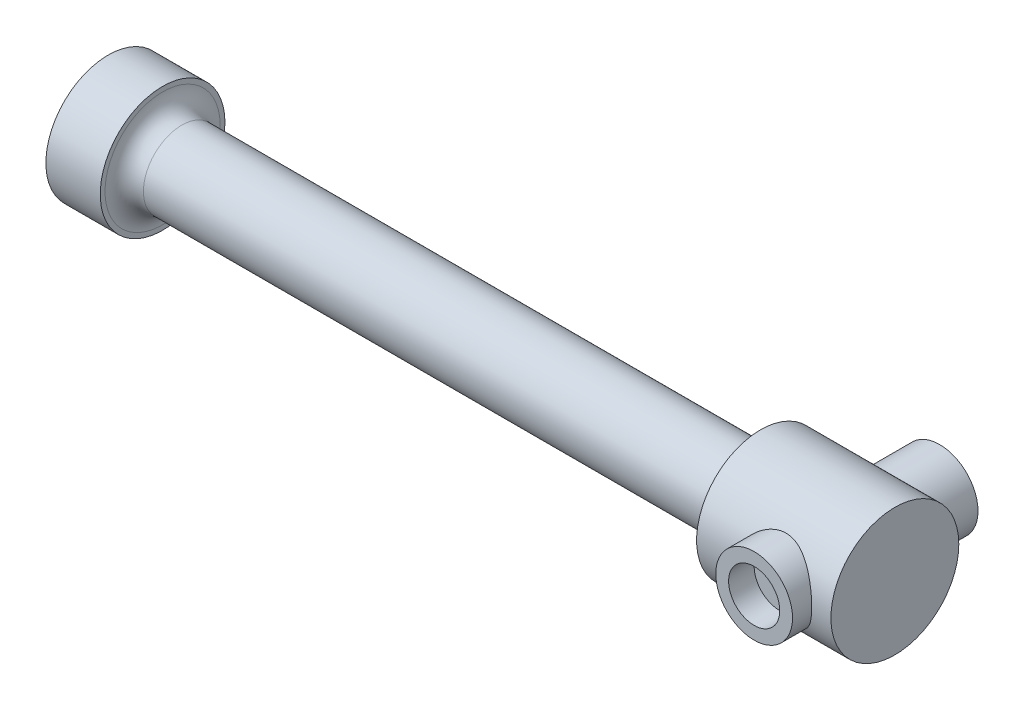
ISO-10303-21;
HEADER;
FILE_DESCRIPTION(('STEP AP214'),'2;1');
FILE_NAME('part.step','',(''),(''),'','','');
FILE_SCHEMA(('AUTOMOTIVE_DESIGN { 1 0 10303 214 1 1 1 1 }'));
ENDSEC;
DATA;
#1=APPLICATION_CONTEXT('core data for automotive mechanical design processes');
#2=APPLICATION_PROTOCOL_DEFINITION('international standard','automotive_design',2000,#1);
#3=PRODUCT_CONTEXT('',#1,'mechanical');
#4=PRODUCT('Part','Part','',(#3));
#5=PRODUCT_RELATED_PRODUCT_CATEGORY('part','',(#4));
#6=PRODUCT_DEFINITION_FORMATION('','',#4);
#7=PRODUCT_DEFINITION_CONTEXT('part definition',#1,'design');
#8=PRODUCT_DEFINITION('design','',#6,#7);
#9=PRODUCT_DEFINITION_SHAPE('','',#8);
#10=(LENGTH_UNIT() NAMED_UNIT(*) SI_UNIT(.MILLI.,.METRE.));
#11=(NAMED_UNIT(*) PLANE_ANGLE_UNIT() SI_UNIT($,.RADIAN.));
#12=(NAMED_UNIT(*) SI_UNIT($,.STERADIAN.) SOLID_ANGLE_UNIT());
#13=UNCERTAINTY_MEASURE_WITH_UNIT(LENGTH_MEASURE(1.E-05),#10,'distance_accuracy_value','');
#14=(GEOMETRIC_REPRESENTATION_CONTEXT(3) GLOBAL_UNCERTAINTY_ASSIGNED_CONTEXT((#13)) GLOBAL_UNIT_ASSIGNED_CONTEXT((#10,
#11,#12)) REPRESENTATION_CONTEXT('',''));
#15=CARTESIAN_POINT('',(0.,0.,0.));
#16=DIRECTION('',(0.,0.,1.));
#17=DIRECTION('',(1.,0.,0.));
#18=AXIS2_PLACEMENT_3D('',#15,#16,#17);
#19=CARTESIAN_POINT('',(114.,0.,-16.001));
#20=DIRECTION('',(0.,0.,1.));
#21=DIRECTION('',(1.,0.,0.));
#22=AXIS2_PLACEMENT_3D('',#19,#20,#21);
#23=CYLINDRICAL_SURFACE('',#22,1.5);
#24=CARTESIAN_POINT('',(114.,0.,9.));
#25=DIRECTION('',(0.,0.,1.));
#26=DIRECTION('',(1.,0.,0.));
#27=AXIS2_PLACEMENT_3D('',#24,#25,#26);
#28=CIRCLE('',#27,1.5);
#29=CARTESIAN_POINT('',(115.5,0.,9.));
#30=VERTEX_POINT('',#29);
#31=EDGE_CURVE('E286',#30,#30,#28,.T.);
#32=ORIENTED_EDGE('',*,*,#31,.T.);
#33=EDGE_LOOP('',(#32));
#34=FACE_BOUND('',#33,.T.);
#35=CARTESIAN_POINT('',(114.,0.,-12.));
#36=DIRECTION('',(0.,0.,-1.));
#37=DIRECTION('',(-1.,0.,0.));
#38=AXIS2_PLACEMENT_3D('',#35,#36,#37);
#39=CIRCLE('',#38,1.5);
#40=CARTESIAN_POINT('',(112.5,0.,-12.));
#41=VERTEX_POINT('',#40);
#42=EDGE_CURVE('E37',#41,#41,#39,.F.);
#43=ORIENTED_EDGE('',*,*,#42,.F.);
#44=EDGE_LOOP('',(#43));
#45=FACE_BOUND('',#44,.T.);
#46=ADVANCED_FACE('F33',(#34,#45),#23,.F.);
#47=CARTESIAN_POINT('',(8.5,0.,0.));
#48=DIRECTION('',(1.,0.,0.));
#49=DIRECTION('',(0.,0.,-1.));
#50=AXIS2_PLACEMENT_3D('',#47,#48,#49);
#51=PLANE('',#50);
#52=CARTESIAN_POINT('',(8.5,0.,0.));
#53=DIRECTION('',(1.,0.,0.));
#54=DIRECTION('',(0.,0.,-1.));
#55=AXIS2_PLACEMENT_3D('',#52,#53,#54);
#56=CIRCLE('',#55,9.);
#57=CARTESIAN_POINT('',(8.5,0.,-9.));
#58=VERTEX_POINT('',#57);
#59=EDGE_CURVE('E46',#58,#58,#56,.F.);
#60=ORIENTED_EDGE('',*,*,#59,.T.);
#61=EDGE_LOOP('',(#60));
#62=FACE_BOUND('',#61,.T.);
#63=CARTESIAN_POINT('',(8.5,0.,0.));
#64=DIRECTION('',(1.,0.,0.));
#65=DIRECTION('',(0.,0.,-1.));
#66=AXIS2_PLACEMENT_3D('',#63,#64,#65);
#67=CIRCLE('',#66,9.75);
#68=CARTESIAN_POINT('',(8.5,0.,-9.75));
#69=VERTEX_POINT('',#68);
#70=EDGE_CURVE('E142',#69,#69,#67,.T.);
#71=ORIENTED_EDGE('',*,*,#70,.T.);
#72=EDGE_LOOP('',(#71));
#73=FACE_BOUND('',#72,.T.);
#74=ADVANCED_FACE('F93',(#62,#73),#51,.T.);
#75=CARTESIAN_POINT('',(8.5,0.,0.));
#76=DIRECTION('',(-1.,0.,0.));
#77=DIRECTION('',(0.,0.,1.));
#78=AXIS2_PLACEMENT_3D('',#75,#76,#77);
#79=CYLINDRICAL_SURFACE('',#78,9.75);
#80=ORIENTED_EDGE('',*,*,#70,.F.);
#81=EDGE_LOOP('',(#80));
#82=FACE_BOUND('',#81,.T.);
#83=CARTESIAN_POINT('',(0.,0.,0.));
#84=DIRECTION('',(1.,0.,0.));
#85=DIRECTION('',(0.,0.,-1.));
#86=AXIS2_PLACEMENT_3D('',#83,#84,#85);
#87=CIRCLE('',#86,9.75);
#88=CARTESIAN_POINT('',(0.,0.,-9.75));
#89=VERTEX_POINT('',#88);
#90=EDGE_CURVE('E138',#89,#89,#87,.T.);
#91=ORIENTED_EDGE('',*,*,#90,.T.);
#92=EDGE_LOOP('',(#91));
#93=FACE_BOUND('',#92,.T.);
#94=ADVANCED_FACE('F99',(#82,#93),#79,.T.);
#95=CARTESIAN_POINT('',(0.,0.,0.));
#96=DIRECTION('',(1.,0.,0.));
#97=DIRECTION('',(0.,0.,-1.));
#98=AXIS2_PLACEMENT_3D('',#95,#96,#97);
#99=PLANE('',#98);
#100=ORIENTED_EDGE('',*,*,#90,.F.);
#101=EDGE_LOOP('',(#100));
#102=FACE_BOUND('',#101,.T.);
#103=ADVANCED_FACE('F156',(#102),#99,.F.);
#104=CARTESIAN_POINT('',(102.,0.,0.));
#105=DIRECTION('',(-1.,0.,0.));
#106=DIRECTION('',(0.,0.,1.));
#107=AXIS2_PLACEMENT_3D('',#104,#105,#106);
#108=CYLINDRICAL_SURFACE('',#107,6.);
#109=CARTESIAN_POINT('',(100.,0.,0.));
#110=DIRECTION('',(1.,0.,0.));
#111=DIRECTION('',(0.,0.,-1.));
#112=AXIS2_PLACEMENT_3D('',#109,#110,#111);
#113=CIRCLE('',#112,6.);
#114=CARTESIAN_POINT('',(100.,0.,-6.));
#115=VERTEX_POINT('',#114);
#116=EDGE_CURVE('E10',#115,#115,#113,.F.);
#117=ORIENTED_EDGE('',*,*,#116,.T.);
#118=EDGE_LOOP('',(#117));
#119=FACE_BOUND('',#118,.T.);
#120=CARTESIAN_POINT('',(11.5,0.,0.));
#121=DIRECTION('',(1.,0.,0.));
#122=DIRECTION('',(0.,0.,-1.));
#123=AXIS2_PLACEMENT_3D('',#120,#121,#122);
#124=CIRCLE('',#123,6.);
#125=CARTESIAN_POINT('',(11.5,0.,-6.));
#126=VERTEX_POINT('',#125);
#127=EDGE_CURVE('E145',#126,#126,#124,.T.);
#128=ORIENTED_EDGE('',*,*,#127,.T.);
#129=EDGE_LOOP('',(#128));
#130=FACE_BOUND('',#129,.T.);
#131=ADVANCED_FACE('F89',(#119,#130),#108,.T.);
#132=CARTESIAN_POINT('',(11.5,0.,0.));
#133=DIRECTION('',(1.,0.,0.));
#134=DIRECTION('',(0.,0.,-1.));
#135=AXIS2_PLACEMENT_3D('',#132,#133,#134);
#136=TOROIDAL_SURFACE('',#135,9.,3.);
#137=ORIENTED_EDGE('',*,*,#59,.F.);
#138=EDGE_LOOP('',(#137));
#139=FACE_BOUND('',#138,.T.);
#140=ORIENTED_EDGE('',*,*,#127,.F.);
#141=EDGE_LOOP('',(#140));
#142=FACE_BOUND('',#141,.T.);
#143=ADVANCED_FACE('F82',(#139,#142),#136,.F.);
#144=CARTESIAN_POINT('',(102.,0.,0.));
#145=DIRECTION('',(1.,0.,0.));
#146=DIRECTION('',(0.,0.,-1.));
#147=AXIS2_PLACEMENT_3D('',#144,#145,#146);
#148=PLANE('',#147);
#149=CARTESIAN_POINT('',(102.,0.,0.));
#150=DIRECTION('',(1.,0.,0.));
#151=DIRECTION('',(0.,0.,-1.));
#152=AXIS2_PLACEMENT_3D('',#149,#150,#151);
#153=CIRCLE('',#152,8.);
#154=CARTESIAN_POINT('',(102.,0.,-8.));
#155=VERTEX_POINT('',#154);
#156=EDGE_CURVE('E41',#155,#155,#153,.T.);
#157=ORIENTED_EDGE('',*,*,#156,.T.);
#158=EDGE_LOOP('',(#157));
#159=FACE_BOUND('',#158,.T.);
#160=CARTESIAN_POINT('',(102.,0.,0.));
#161=DIRECTION('',(1.,0.,0.));
#162=DIRECTION('',(0.,0.,-1.));
#163=AXIS2_PLACEMENT_3D('',#160,#161,#162);
#164=CIRCLE('',#163,10.);
#165=CARTESIAN_POINT('',(102.,0.,-10.));
#166=VERTEX_POINT('',#165);
#167=EDGE_CURVE('E139',#166,#166,#164,.T.);
#168=ORIENTED_EDGE('',*,*,#167,.F.);
#169=EDGE_LOOP('',(#168));
#170=FACE_BOUND('',#169,.T.);
#171=ADVANCED_FACE('F80',(#159,#170),#148,.F.);
#172=CARTESIAN_POINT('',(123.,0.,0.));
#173=DIRECTION('',(-1.,0.,0.));
#174=DIRECTION('',(0.,0.,1.));
#175=AXIS2_PLACEMENT_3D('',#172,#173,#174);
#176=CYLINDRICAL_SURFACE('',#175,10.);
#177=CARTESIAN_POINT('',(120.,0.,10.));
#178=CARTESIAN_POINT('',(119.999998745191,-0.153537444551437,9.99999883168644));
#179=CARTESIAN_POINT('',(119.9940973574,-0.307113729394928,9.99645496091162));
#180=CARTESIAN_POINT('',(119.970566986841,-0.613107521326879,9.98236364463673));
#181=CARTESIAN_POINT('',(119.952931142188,-0.76552429760002,9.97181210130936));
#182=CARTESIAN_POINT('',(119.906127895651,-1.06824745150987,9.94394249918953));
#183=CARTESIAN_POINT('',(119.876938661774,-1.21854927251923,9.926611630499));
#184=CARTESIAN_POINT('',(119.807400061742,-1.51572002727398,9.88560105277181));
#185=CARTESIAN_POINT('',(119.767045930178,-1.66258746605991,9.86191863289495));
#186=CARTESIAN_POINT('',(119.675912399103,-1.95109561530948,9.80890481966906));
#187=CARTESIAN_POINT('',(119.62519085957,-2.09276039690219,9.77960483164848));
#188=CARTESIAN_POINT('',(119.513725630889,-2.37093083799643,9.7159192851634));
#189=CARTESIAN_POINT('',(119.452978069542,-2.50743447905545,9.68153176235135));
#190=CARTESIAN_POINT('',(119.256615921481,-2.90796291658618,9.57184162303338));
#191=CARTESIAN_POINT('',(119.106765140666,-3.1633697760085,9.4899416782257));
#192=CARTESIAN_POINT('',(118.760891856919,-3.66523770071095,9.30821070093225));
#193=CARTESIAN_POINT('',(118.562214867513,-3.90952112480153,9.20748739861886));
#194=CARTESIAN_POINT('',(118.130101497822,-4.36354579042122,9.00120183744764));
#195=CARTESIAN_POINT('',(117.896620567373,-4.57324202374219,8.89563349844521));
#196=CARTESIAN_POINT('',(117.508001002179,-4.87082578782842,8.73441166956493));
#197=CARTESIAN_POINT('',(117.363367381755,-4.97182330842635,8.67715724472595));
#198=CARTESIAN_POINT('',(117.064805642624,-5.16122122731058,8.56585317782531));
#199=CARTESIAN_POINT('',(116.910875994797,-5.24961954505302,8.511804065925));
#200=CARTESIAN_POINT('',(116.594622317587,-5.41290775237596,8.40890843735161));
#201=CARTESIAN_POINT('',(116.432309612332,-5.48781528185459,8.36005516160798));
#202=CARTESIAN_POINT('',(116.099941829181,-5.62338163354011,8.26947589323735));
#203=CARTESIAN_POINT('',(115.929889668991,-5.68404577312335,8.22774724242061));
#204=CARTESIAN_POINT('',(115.625079920862,-5.77737221892758,8.16237611554734));
#205=CARTESIAN_POINT('',(115.491716651134,-5.8132588951073,8.13679954295732));
#206=CARTESIAN_POINT('',(115.221870482181,-5.87590039350671,8.09168021123358));
#207=CARTESIAN_POINT('',(115.085388281244,-5.90265723881365,8.07213611544971));
#208=CARTESIAN_POINT('',(114.810251714021,-5.94666970539668,8.03976789878061));
#209=CARTESIAN_POINT('',(114.671599731358,-5.9639350903157,8.02693687297642));
#210=CARTESIAN_POINT('',(114.392944984699,-5.9887526638035,8.00843825390027));
#211=CARTESIAN_POINT('',(114.252942197494,-5.99630468517717,8.00277078393386));
#212=CARTESIAN_POINT('',(113.972369514264,-6.00157990771218,7.99881555301096));
#213=CARTESIAN_POINT('',(113.831799044393,-5.99928372966397,8.00054234240933));
#214=CARTESIAN_POINT('',(113.551452631554,-5.98485668610316,8.01134007353734));
#215=CARTESIAN_POINT('',(113.41167669245,-5.97272577280601,8.02041105095058));
#216=CARTESIAN_POINT('',(113.133876805591,-5.93880584038254,8.04555965197211));
#217=CARTESIAN_POINT('',(112.995853676696,-5.91701246647433,8.06164043478003));
#218=CARTESIAN_POINT('',(112.722505408924,-5.86407894147697,8.10022471868288));
#219=CARTESIAN_POINT('',(112.587181396816,-5.83293497053064,8.12273084444056));
#220=CARTESIAN_POINT('',(112.190039218444,-5.7269806380151,8.19812127089691));
#221=CARTESIAN_POINT('',(111.933129362913,-5.63915194131273,8.25926888138427));
#222=CARTESIAN_POINT('',(111.437182443319,-5.43180047493028,8.39708163578851));
#223=CARTESIAN_POINT('',(111.19815197252,-5.31226608650176,8.47375246584326));
#224=CARTESIAN_POINT('',(110.700051973396,-5.02070076963739,8.65022234735539));
#225=CARTESIAN_POINT('',(110.444785119534,-4.84314550121072,8.75172142070218));
#226=CARTESIAN_POINT('',(110.085230823983,-4.54957124280612,8.90582410728344));
#227=CARTESIAN_POINT('',(109.969189776868,-4.44708318574261,8.95754136048025));
#228=CARTESIAN_POINT('',(109.745217586189,-4.23329437801549,9.06053415675082));
#229=CARTESIAN_POINT('',(109.637287889964,-4.12199206183187,9.11180961955592));
#230=CARTESIAN_POINT('',(109.415562196611,-3.87481857478412,9.21989326570381));
#231=CARTESIAN_POINT('',(109.303055390159,-3.73768795265441,9.27647282365172));
#232=CARTESIAN_POINT('',(109.090073335409,-3.45314122942453,9.38610941141658));
#233=CARTESIAN_POINT('',(108.989593417424,-3.30572915572596,9.43916780480959));
#234=CARTESIAN_POINT('',(108.801519489967,-3.00130059968161,9.54033102133581));
#235=CARTESIAN_POINT('',(108.713923953926,-2.84428525827774,9.58843643110623));
#236=CARTESIAN_POINT('',(108.552589758162,-2.52155783578282,9.67831544597726));
#237=CARTESIAN_POINT('',(108.47884937857,-2.35584683737316,9.72008983683586));
#238=CARTESIAN_POINT('',(108.350395779526,-2.02757278212966,9.79364255267099));
#239=CARTESIAN_POINT('',(108.294776852394,-1.86546851518059,9.82588466787389));
#240=CARTESIAN_POINT('',(108.197354045748,-1.53584722067878,9.88276955471718));
#241=CARTESIAN_POINT('',(108.15554976973,-1.36833034862805,9.90741254446339));
#242=CARTESIAN_POINT('',(108.086455507211,-1.02949369065076,9.94832818480364));
#243=CARTESIAN_POINT('',(108.059151054434,-0.858177873374311,9.96460917751309));
#244=CARTESIAN_POINT('',(108.01947106463,-0.513226306032294,9.9883166876579));
#245=CARTESIAN_POINT('',(108.007093427881,-0.339590885735249,9.99574445045558));
#246=CARTESIAN_POINT('',(107.998136179932,-0.015428594246427,10.0011181661532));
#247=CARTESIAN_POINT('',(107.999637405943,0.135030316693078,10.0002160020556));
#248=CARTESIAN_POINT('',(108.013919562041,0.435218261170644,9.99165275901541));
#249=CARTESIAN_POINT('',(108.026700120559,0.584947318588576,9.98399190272153));
#250=CARTESIAN_POINT('',(108.063367363032,0.882536056591296,9.96209775285793));
#251=CARTESIAN_POINT('',(108.087253288556,1.03039586412686,9.94786490811761));
#252=CARTESIAN_POINT('',(108.145821548111,1.32321247217726,9.913165472997));
#253=CARTESIAN_POINT('',(108.180504150208,1.46816920051815,9.89269872783916));
#254=CARTESIAN_POINT('',(108.259272160967,1.75071908629022,9.84657104453397));
#255=CARTESIAN_POINT('',(108.303105141372,1.88840566825772,9.82105034214295));
#256=CARTESIAN_POINT('',(108.400198532975,2.15939029274506,9.76505054291718));
#257=CARTESIAN_POINT('',(108.453461981776,2.29268690477589,9.73456984870001));
#258=CARTESIAN_POINT('',(108.626663243989,2.6849253601121,9.6365771020272));
#259=CARTESIAN_POINT('',(108.760070479651,2.93642286384019,9.56247925125989));
#260=CARTESIAN_POINT('',(109.074235119669,3.44006129431898,9.39381699318939));
#261=CARTESIAN_POINT('',(109.258469262826,3.6895614151548,9.29792673244944));
#262=CARTESIAN_POINT('',(109.66159165795,4.15611932969619,9.09895598301211));
#263=CARTESIAN_POINT('',(109.880520236191,4.37313879233219,8.99586720626164));
#264=CARTESIAN_POINT('',(110.24723481991,4.68476192706762,8.83567180051124));
#265=CARTESIAN_POINT('',(110.384610416055,4.79158950335552,8.77804452474304));
#266=CARTESIAN_POINT('',(110.668777374529,4.99332637800022,8.66487441639237));
#267=CARTESIAN_POINT('',(110.81557115637,5.08823259511327,8.60933212529391));
#268=CARTESIAN_POINT('',(111.117846869394,5.26534568264162,8.50216742436207));
#269=CARTESIAN_POINT('',(111.273322897011,5.34756104251848,8.45054240595252));
#270=CARTESIAN_POINT('',(111.592308684127,5.49855628026275,8.35308038859148));
#271=CARTESIAN_POINT('',(111.755812655853,5.56734566466804,8.30723930239864));
#272=CARTESIAN_POINT('',(112.053963002338,5.67736385859907,8.23231224945508));
#273=CARTESIAN_POINT('',(112.187229386013,5.72133709184488,8.20174483337219));
#274=CARTESIAN_POINT('',(112.457553736731,5.80005690886224,8.14626667510692));
#275=CARTESIAN_POINT('',(112.59460966938,5.83480834103845,8.12135296146618));
#276=CARTESIAN_POINT('',(112.871688404292,5.8946568885387,8.07801879862436));
#277=CARTESIAN_POINT('',(113.011708139346,5.91976351478428,8.05959195410913));
#278=CARTESIAN_POINT('',(113.293932521359,5.9600153732825,8.02987210085862));
#279=CARTESIAN_POINT('',(113.436137181068,5.97516054737435,8.01857913377509));
#280=CARTESIAN_POINT('',(113.722213824173,5.99528753337017,8.0035422228399));
#281=CARTESIAN_POINT('',(113.866090097559,6.00023037231476,7.999827227501));
#282=CARTESIAN_POINT('',(114.153815740271,5.99975311757475,8.00018515536029));
#283=CARTESIAN_POINT('',(114.29766510955,5.99433300567701,8.00425809224595));
#284=CARTESIAN_POINT('',(114.584248956659,5.97321593242882,8.02002886262284));
#285=CARTESIAN_POINT('',(114.726982871581,5.9575140835971,8.03173032236349));
#286=CARTESIAN_POINT('',(115.010198154241,5.91607855231599,8.06229956209071));
#287=CARTESIAN_POINT('',(115.150679512675,5.89034482844307,8.08116737166849));
#288=CARTESIAN_POINT('',(115.42172585741,5.83069515235667,8.12430163249588));
#289=CARTESIAN_POINT('',(115.552441159206,5.79723709119027,8.14826151524265));
#290=CARTESIAN_POINT('',(115.810385741413,5.72193802024643,8.2013135481482));
#291=CARTESIAN_POINT('',(115.937613829714,5.68009418342385,8.23040742870394));
#292=CARTESIAN_POINT('',(116.31322746154,5.54256357829889,8.32420030637917));
#293=CARTESIAN_POINT('',(116.555679953471,5.43484692597259,8.39543383966226));
#294=CARTESIAN_POINT('',(117.057312736404,5.17156568978209,8.56052345401851));
#295=CARTESIAN_POINT('',(117.313346125629,5.01119401055784,8.6561736985039));
#296=CARTESIAN_POINT('',(117.797538595375,4.65500060946757,8.85281489413667));
#297=CARTESIAN_POINT('',(118.025674461098,4.45914969547372,8.95381019436587));
#298=CARTESIAN_POINT('',(118.36183660388,4.12370341470835,9.11118672816113));
#299=CARTESIAN_POINT('',(118.48022504267,3.9947869496437,9.16858001952611));
#300=CARTESIAN_POINT('',(118.705753497502,3.72646931290711,9.28086988407214));
#301=CARTESIAN_POINT('',(118.812896949807,3.58707136666572,9.3357672170491));
#302=CARTESIAN_POINT('',(119.015218004567,3.29828675494298,9.44166188164684));
#303=CARTESIAN_POINT('',(119.110387078295,3.14889308474009,9.49265642349905));
#304=CARTESIAN_POINT('',(119.287766851204,2.84096458145434,9.58931425936429));
#305=CARTESIAN_POINT('',(119.369979172956,2.68243089637472,9.63497822073852));
#306=CARTESIAN_POINT('',(119.518207155826,2.36211349400593,9.71838319081371));
#307=CARTESIAN_POINT('',(119.584638495226,2.20057425723904,9.75632252421503));
#308=CARTESIAN_POINT('',(119.703530953194,1.87094026552715,9.82486154361095));
#309=CARTESIAN_POINT('',(119.75599475181,1.70284677529883,9.85546263753239));
#310=CARTESIAN_POINT('',(119.846016943351,1.36200638705991,9.90830915235697));
#311=CARTESIAN_POINT('',(119.883621672215,1.18927577776316,9.93058053649489));
#312=CARTESIAN_POINT('',(119.943489192635,0.840366716144949,9.96616672075865));
#313=CARTESIAN_POINT('',(119.965764761897,0.664191261592111,9.97948898025471));
#314=CARTESIAN_POINT('',(119.986783372373,0.406248020354684,9.99207457493582));
#315=CARTESIAN_POINT('',(119.991736975677,0.325112869232335,9.99504405536016));
#316=CARTESIAN_POINT('',(119.998345679055,0.16265544935751,9.99900711160739));
#317=CARTESIAN_POINT('',(120.000000664708,0.0813331742121601,10.0000006188891));
#318=CARTESIAN_POINT('',(120.,0.,10.));
#319=B_SPLINE_CURVE_WITH_KNOTS('',3,(#177,#178,#179,#180,#181,#182,#183,#184,#185,#186,#187,
#188,#189,#190,#191,#192,#193,#194,#195,#196,#197,#198,#199,#200,#201,#202,#203,#204,#205,#206,
#207,#208,#209,#210,#211,#212,#213,#214,#215,#216,#217,#218,#219,#220,#221,#222,#223,#224,#225,
#226,#227,#228,#229,#230,#231,#232,#233,#234,#235,#236,#237,#238,#239,#240,#241,#242,#243,#244,
#245,#246,#247,#248,#249,#250,#251,#252,#253,#254,#255,#256,#257,#258,#259,#260,#261,#262,#263,
#264,#265,#266,#267,#268,#269,#270,#271,#272,#273,#274,#275,#276,#277,#278,#279,#280,#281,#282,
#283,#284,#285,#286,#287,#288,#289,#290,#291,#292,#293,#294,#295,#296,#297,#298,#299,#300,#301,
#302,#303,#304,#305,#306,#307,#308,#309,#310,#311,#312,#313,#314,#315,#316,#317,#318),
.UNSPECIFIED.,.T.,.F.,(4,2,2,2,2,2,2,2,2,2,2,2,2,2,2,2,2,2,2,2,2,2,2,2,2,2,2,2,2,2,2,2,2,2,2,2,
2,2,2,2,2,2,2,2,2,2,2,2,2,2,2,2,2,2,2,2,2,2,2,2,2,2,2,2,2,2,2,2,2,2,4),(0.,0.460526601189237,
0.921322738666801,1.38299381403058,1.84486224490669,2.30422013956031,2.76375586197537,
3.68167311554442,4.66978395284543,5.65917064091952,6.21499415637781,6.77090935054834,
7.32609229452149,7.88106764554409,8.30201487574484,8.72286876721018,9.14328892216057,
9.56371631366181,9.98497139806241,10.40622852925,10.8276757104407,11.2492952938386,
12.0807558666506,12.9125215553463,13.8897049719634,14.3790534646455,14.8684890673691,
15.4263461011955,15.983985828052,16.5415594312421,17.0990637758594,17.6214641151699,
18.1438494594443,18.6657126431692,19.1875024090024,19.638346895262,20.0891765301004,
20.5399753803935,20.9907854241961,21.4305002375878,21.8703569439357,22.7494233427058,
23.7197001490793,24.6911131196182,25.2405264723239,25.7900815377537,26.3392673739261,
26.8880629256888,27.3185187217206,27.7487477532128,28.1785514321197,28.6083576204496,
29.0398026540948,29.4712484460159,29.9028994771413,30.3345522906549,30.7452488920627,
31.156084182716,31.9773303104338,32.9246646516038,33.8727820243207,34.4248169890477,
34.9766827677429,35.5289394130232,36.0811268442984,36.6165634055116,37.1518971546363,
37.6855481107011,38.2187536985203,38.4626993445495,38.706653452248),.UNSPECIFIED.);
#320=CARTESIAN_POINT('',(120.,0.,10.));
#321=VERTEX_POINT('',#320);
#322=EDGE_CURVE('E57',#321,#321,#319,.T.);
#323=ORIENTED_EDGE('',*,*,#322,.T.);
#324=EDGE_LOOP('',(#323));
#325=FACE_BOUND('',#324,.T.);
#326=CARTESIAN_POINT('',(120.,0.,-10.));
#327=CARTESIAN_POINT('',(119.999998745191,0.153537444551437,-9.99999883168644));
#328=CARTESIAN_POINT('',(119.9940973574,0.307113729394929,-9.99645496091162));
#329=CARTESIAN_POINT('',(119.970566986841,0.613107521326879,-9.98236364463673));
#330=CARTESIAN_POINT('',(119.952931142188,0.76552429760002,-9.97181210130936));
#331=CARTESIAN_POINT('',(119.906127895651,1.06824745150987,-9.94394249918953));
#332=CARTESIAN_POINT('',(119.876938661774,1.21854927251923,-9.926611630499));
#333=CARTESIAN_POINT('',(119.807400061742,1.51572002727398,-9.88560105277181));
#334=CARTESIAN_POINT('',(119.767045930178,1.66258746605991,-9.86191863289495));
#335=CARTESIAN_POINT('',(119.675912399103,1.95109561530948,-9.80890481966906));
#336=CARTESIAN_POINT('',(119.62519085957,2.0927603969022,-9.77960483164847));
#337=CARTESIAN_POINT('',(119.513725630889,2.37093083799643,-9.7159192851634));
#338=CARTESIAN_POINT('',(119.452978069542,2.50743447905546,-9.68153176235135));
#339=CARTESIAN_POINT('',(119.256615921481,2.90796291658619,-9.57184162303337));
#340=CARTESIAN_POINT('',(119.106765140666,3.16336977600851,-9.48994167822569));
#341=CARTESIAN_POINT('',(118.760891856919,3.66523770071096,-9.30821070093225));
#342=CARTESIAN_POINT('',(118.562214867513,3.90952112480153,-9.20748739861886));
#343=CARTESIAN_POINT('',(118.130101497822,4.36354579042122,-9.00120183744764));
#344=CARTESIAN_POINT('',(117.896620567373,4.57324202374219,-8.89563349844521));
#345=CARTESIAN_POINT('',(117.508001002179,4.87082578782842,-8.73441166956493));
#346=CARTESIAN_POINT('',(117.363367381755,4.97182330842636,-8.67715724472595));
#347=CARTESIAN_POINT('',(117.064805642624,5.16122122731059,-8.56585317782531));
#348=CARTESIAN_POINT('',(116.910875994797,5.24961954505302,-8.51180406592499));
#349=CARTESIAN_POINT('',(116.594622317587,5.41290775237596,-8.40890843735162));
#350=CARTESIAN_POINT('',(116.432309612332,5.48781528185458,-8.36005516160798));
#351=CARTESIAN_POINT('',(116.099941829181,5.62338163354011,-8.26947589323735));
#352=CARTESIAN_POINT('',(115.929889668991,5.68404577312335,-8.22774724242061));
#353=CARTESIAN_POINT('',(115.625079920862,5.77737221892758,-8.16237611554734));
#354=CARTESIAN_POINT('',(115.491716651134,5.8132588951073,-8.13679954295732));
#355=CARTESIAN_POINT('',(115.221870482181,5.87590039350671,-8.09168021123358));
#356=CARTESIAN_POINT('',(115.085388281244,5.90265723881365,-8.07213611544971));
#357=CARTESIAN_POINT('',(114.810251714021,5.94666970539668,-8.03976789878061));
#358=CARTESIAN_POINT('',(114.671599731358,5.9639350903157,-8.02693687297642));
#359=CARTESIAN_POINT('',(114.392944984699,5.9887526638035,-8.00843825390027));
#360=CARTESIAN_POINT('',(114.252942197494,5.99630468517717,-8.00277078393386));
#361=CARTESIAN_POINT('',(113.972369514264,6.00157990771218,-7.99881555301096));
#362=CARTESIAN_POINT('',(113.831799044393,5.99928372966397,-8.00054234240933));
#363=CARTESIAN_POINT('',(113.551452631554,5.98485668610316,-8.01134007353734));
#364=CARTESIAN_POINT('',(113.41167669245,5.97272577280601,-8.02041105095058));
#365=CARTESIAN_POINT('',(113.133876805591,5.93880584038254,-8.04555965197211));
#366=CARTESIAN_POINT('',(112.995853676696,5.91701246647433,-8.06164043478003));
#367=CARTESIAN_POINT('',(112.722505408924,5.86407894147697,-8.10022471868288));
#368=CARTESIAN_POINT('',(112.587181396816,5.83293497053064,-8.12273084444056));
#369=CARTESIAN_POINT('',(112.190039218444,5.7269806380151,-8.19812127089691));
#370=CARTESIAN_POINT('',(111.933129362913,5.63915194131273,-8.25926888138427));
#371=CARTESIAN_POINT('',(111.437182443319,5.43180047493028,-8.39708163578851));
#372=CARTESIAN_POINT('',(111.19815197252,5.31226608650176,-8.47375246584326));
#373=CARTESIAN_POINT('',(110.700051973396,5.02070076963739,-8.65022234735539));
#374=CARTESIAN_POINT('',(110.444785119534,4.84314550121072,-8.75172142070218));
#375=CARTESIAN_POINT('',(110.085230823983,4.54957124280612,-8.90582410728344));
#376=CARTESIAN_POINT('',(109.969189776868,4.44708318574261,-8.95754136048025));
#377=CARTESIAN_POINT('',(109.745217586189,4.23329437801549,-9.06053415675082));
#378=CARTESIAN_POINT('',(109.637287889964,4.12199206183187,-9.11180961955592));
#379=CARTESIAN_POINT('',(109.415562196611,3.87481857478412,-9.21989326570381));
#380=CARTESIAN_POINT('',(109.303055390159,3.73768795265441,-9.27647282365172));
#381=CARTESIAN_POINT('',(109.090073335409,3.45314122942453,-9.38610941141658));
#382=CARTESIAN_POINT('',(108.989593417424,3.30572915572596,-9.43916780480959));
#383=CARTESIAN_POINT('',(108.801519489967,3.00130059968161,-9.54033102133581));
#384=CARTESIAN_POINT('',(108.713923953926,2.84428525827774,-9.58843643110622));
#385=CARTESIAN_POINT('',(108.552589758162,2.52155783578282,-9.67831544597726));
#386=CARTESIAN_POINT('',(108.47884937857,2.35584683737316,-9.72008983683586));
#387=CARTESIAN_POINT('',(108.350395779526,2.02757278212966,-9.79364255267099));
#388=CARTESIAN_POINT('',(108.294776852394,1.86546851518059,-9.82588466787389));
#389=CARTESIAN_POINT('',(108.197354045748,1.53584722067877,-9.88276955471718));
#390=CARTESIAN_POINT('',(108.15554976973,1.36833034862805,-9.90741254446339));
#391=CARTESIAN_POINT('',(108.086455507211,1.02949369065076,-9.94832818480364));
#392=CARTESIAN_POINT('',(108.059151054434,0.858177873374309,-9.96460917751309));
#393=CARTESIAN_POINT('',(108.01947106463,0.513226306032293,-9.9883166876579));
#394=CARTESIAN_POINT('',(108.007093427881,0.339590885735247,-9.99574445045557));
#395=CARTESIAN_POINT('',(107.998136179932,0.0154285942464256,-10.0011181661532));
#396=CARTESIAN_POINT('',(107.999637405943,-0.135030316693079,-10.0002160020556));
#397=CARTESIAN_POINT('',(108.013919562041,-0.435218261170645,-9.99165275901541));
#398=CARTESIAN_POINT('',(108.026700120559,-0.584947318588577,-9.98399190272153));
#399=CARTESIAN_POINT('',(108.063367363032,-0.882536056591297,-9.96209775285793));
#400=CARTESIAN_POINT('',(108.087253288556,-1.03039586412686,-9.94786490811761));
#401=CARTESIAN_POINT('',(108.145821548111,-1.32321247217726,-9.913165472997));
#402=CARTESIAN_POINT('',(108.180504150208,-1.46816920051815,-9.89269872783916));
#403=CARTESIAN_POINT('',(108.259272160967,-1.75071908629022,-9.84657104453397));
#404=CARTESIAN_POINT('',(108.303105141372,-1.88840566825772,-9.82105034214295));
#405=CARTESIAN_POINT('',(108.400198532975,-2.15939029274506,-9.76505054291718));
#406=CARTESIAN_POINT('',(108.453461981776,-2.29268690477589,-9.73456984870001));
#407=CARTESIAN_POINT('',(108.626663243989,-2.6849253601121,-9.6365771020272));
#408=CARTESIAN_POINT('',(108.760070479651,-2.93642286384019,-9.56247925125989));
#409=CARTESIAN_POINT('',(109.074235119669,-3.44006129431898,-9.39381699318939));
#410=CARTESIAN_POINT('',(109.258469262826,-3.6895614151548,-9.29792673244944));
#411=CARTESIAN_POINT('',(109.66159165795,-4.15611932969619,-9.09895598301211));
#412=CARTESIAN_POINT('',(109.880520236191,-4.37313879233219,-8.99586720626164));
#413=CARTESIAN_POINT('',(110.24723481991,-4.68476192706762,-8.83567180051124));
#414=CARTESIAN_POINT('',(110.384610416055,-4.79158950335552,-8.77804452474304));
#415=CARTESIAN_POINT('',(110.668777374529,-4.99332637800022,-8.66487441639237));
#416=CARTESIAN_POINT('',(110.81557115637,-5.08823259511327,-8.60933212529391));
#417=CARTESIAN_POINT('',(111.117846869394,-5.26534568264162,-8.50216742436207));
#418=CARTESIAN_POINT('',(111.273322897011,-5.34756104251848,-8.45054240595252));
#419=CARTESIAN_POINT('',(111.592308684127,-5.49855628026275,-8.35308038859149));
#420=CARTESIAN_POINT('',(111.755812655853,-5.56734566466804,-8.30723930239864));
#421=CARTESIAN_POINT('',(112.053963002338,-5.67736385859907,-8.23231224945508));
#422=CARTESIAN_POINT('',(112.187229386013,-5.72133709184488,-8.20174483337219));
#423=CARTESIAN_POINT('',(112.457553736731,-5.80005690886224,-8.14626667510693));
#424=CARTESIAN_POINT('',(112.59460966938,-5.83480834103845,-8.12135296146618));
#425=CARTESIAN_POINT('',(112.871688404292,-5.8946568885387,-8.07801879862436));
#426=CARTESIAN_POINT('',(113.011708139346,-5.91976351478428,-8.05959195410913));
#427=CARTESIAN_POINT('',(113.293932521359,-5.9600153732825,-8.02987210085862));
#428=CARTESIAN_POINT('',(113.436137181068,-5.97516054737435,-8.01857913377509));
#429=CARTESIAN_POINT('',(113.722213824173,-5.99528753337017,-8.0035422228399));
#430=CARTESIAN_POINT('',(113.866090097559,-6.00023037231476,-7.999827227501));
#431=CARTESIAN_POINT('',(114.153815740271,-5.99975311757475,-8.00018515536029));
#432=CARTESIAN_POINT('',(114.29766510955,-5.99433300567701,-8.00425809224595));
#433=CARTESIAN_POINT('',(114.584248956659,-5.97321593242882,-8.02002886262284));
#434=CARTESIAN_POINT('',(114.726982871581,-5.9575140835971,-8.03173032236349));
#435=CARTESIAN_POINT('',(115.010198154241,-5.91607855231599,-8.06229956209071));
#436=CARTESIAN_POINT('',(115.150679512675,-5.89034482844307,-8.08116737166849));
#437=CARTESIAN_POINT('',(115.42172585741,-5.83069515235667,-8.12430163249588));
#438=CARTESIAN_POINT('',(115.552441159206,-5.79723709119027,-8.14826151524265));
#439=CARTESIAN_POINT('',(115.810385741413,-5.72193802024643,-8.2013135481482));
#440=CARTESIAN_POINT('',(115.937613829714,-5.68009418342385,-8.23040742870394));
#441=CARTESIAN_POINT('',(116.31322746154,-5.54256357829889,-8.32420030637917));
#442=CARTESIAN_POINT('',(116.555679953471,-5.43484692597259,-8.39543383966226));
#443=CARTESIAN_POINT('',(117.057312736404,-5.17156568978209,-8.56052345401851));
#444=CARTESIAN_POINT('',(117.313346125629,-5.01119401055784,-8.6561736985039));
#445=CARTESIAN_POINT('',(117.797538595375,-4.65500060946757,-8.85281489413667));
#446=CARTESIAN_POINT('',(118.025674461098,-4.45914969547372,-8.95381019436587));
#447=CARTESIAN_POINT('',(118.36183660388,-4.12370341470835,-9.11118672816113));
#448=CARTESIAN_POINT('',(118.48022504267,-3.9947869496437,-9.16858001952611));
#449=CARTESIAN_POINT('',(118.705753497502,-3.72646931290711,-9.28086988407214));
#450=CARTESIAN_POINT('',(118.812896949807,-3.58707136666572,-9.3357672170491));
#451=CARTESIAN_POINT('',(119.015218004567,-3.29828675494298,-9.44166188164684));
#452=CARTESIAN_POINT('',(119.110387078295,-3.14889308474009,-9.49265642349905));
#453=CARTESIAN_POINT('',(119.287766851204,-2.84096458145434,-9.58931425936429));
#454=CARTESIAN_POINT('',(119.369979172956,-2.68243089637472,-9.63497822073852));
#455=CARTESIAN_POINT('',(119.518207155826,-2.36211349400593,-9.71838319081371));
#456=CARTESIAN_POINT('',(119.584638495226,-2.20057425723904,-9.75632252421502));
#457=CARTESIAN_POINT('',(119.703530953194,-1.87094026552716,-9.82486154361095));
#458=CARTESIAN_POINT('',(119.75599475181,-1.70284677529883,-9.85546263753239));
#459=CARTESIAN_POINT('',(119.846016943351,-1.36200638705992,-9.90830915235697));
#460=CARTESIAN_POINT('',(119.883621672215,-1.18927577776316,-9.93058053649488));
#461=CARTESIAN_POINT('',(119.943489192635,-0.84036671614495,-9.96616672075865));
#462=CARTESIAN_POINT('',(119.965764761897,-0.664191261592112,-9.97948898025471));
#463=CARTESIAN_POINT('',(119.986783372373,-0.406248020354685,-9.99207457493582));
#464=CARTESIAN_POINT('',(119.991736975677,-0.325112869232336,-9.99504405536016));
#465=CARTESIAN_POINT('',(119.998345679055,-0.16265544935751,-9.99900711160739));
#466=CARTESIAN_POINT('',(120.000000664708,-0.0813331742121603,-10.0000006188891));
#467=CARTESIAN_POINT('',(120.,0.,-10.));
#468=B_SPLINE_CURVE_WITH_KNOTS('',3,(#326,#327,#328,#329,#330,#331,#332,#333,#334,#335,#336,
#337,#338,#339,#340,#341,#342,#343,#344,#345,#346,#347,#348,#349,#350,#351,#352,#353,#354,#355,
#356,#357,#358,#359,#360,#361,#362,#363,#364,#365,#366,#367,#368,#369,#370,#371,#372,#373,#374,
#375,#376,#377,#378,#379,#380,#381,#382,#383,#384,#385,#386,#387,#388,#389,#390,#391,#392,#393,
#394,#395,#396,#397,#398,#399,#400,#401,#402,#403,#404,#405,#406,#407,#408,#409,#410,#411,#412,
#413,#414,#415,#416,#417,#418,#419,#420,#421,#422,#423,#424,#425,#426,#427,#428,#429,#430,#431,
#432,#433,#434,#435,#436,#437,#438,#439,#440,#441,#442,#443,#444,#445,#446,#447,#448,#449,#450,
#451,#452,#453,#454,#455,#456,#457,#458,#459,#460,#461,#462,#463,#464,#465,#466,#467),
.UNSPECIFIED.,.T.,.F.,(4,2,2,2,2,2,2,2,2,2,2,2,2,2,2,2,2,2,2,2,2,2,2,2,2,2,2,2,2,2,2,2,2,2,2,2,
2,2,2,2,2,2,2,2,2,2,2,2,2,2,2,2,2,2,2,2,2,2,2,2,2,2,2,2,2,2,2,2,2,2,4),(0.,0.460526601189237,
0.921322738666801,1.38299381403058,1.84486224490669,2.30422013956031,2.76375586197539,
3.68167311554442,4.66978395284543,5.65917064091951,6.21499415637784,6.77090935054834,
7.32609229452147,7.88106764554409,8.30201487574484,8.72286876721018,9.14328892216057,
9.5637163136618,9.9849713980624,10.40622852925,10.8276757104407,11.2492952938386,
12.0807558666506,12.9125215553463,13.8897049719634,14.3790534646455,14.8684890673691,
15.4263461011955,15.983985828052,16.5415594312421,17.0990637758594,17.6214641151699,
18.1438494594443,18.6657126431692,19.1875024090024,19.638346895262,20.0891765301004,
20.5399753803935,20.9907854241961,21.4305002375878,21.8703569439357,22.7494233427058,
23.7197001490793,24.6911131196182,25.2405264723239,25.7900815377537,26.3392673739261,
26.8880629256888,27.3185187217206,27.7487477532128,28.1785514321197,28.6083576204495,
29.0398026540948,29.4712484460159,29.9028994771413,30.3345522906548,30.7452488920627,
31.156084182716,31.9773303104338,32.9246646516038,33.8727820243207,34.4248169890476,
34.9766827677429,35.5289394130232,36.0811268442983,36.6165634055116,37.1518971546363,
37.6855481107011,38.2187536985203,38.4626993445495,38.706653452248),.UNSPECIFIED.);
#469=CARTESIAN_POINT('',(120.,0.,-10.));
#470=VERTEX_POINT('',#469);
#471=EDGE_CURVE('E50',#470,#470,#468,.T.);
#472=ORIENTED_EDGE('',*,*,#471,.T.);
#473=EDGE_LOOP('',(#472));
#474=FACE_BOUND('',#473,.T.);
#475=CARTESIAN_POINT('',(123.,0.,0.));
#476=DIRECTION('',(1.,0.,0.));
#477=DIRECTION('',(0.,0.,-1.));
#478=AXIS2_PLACEMENT_3D('',#475,#476,#477);
#479=CIRCLE('',#478,10.);
#480=CARTESIAN_POINT('',(123.,0.,-10.));
#481=VERTEX_POINT('',#480);
#482=EDGE_CURVE('E135',#481,#481,#479,.T.);
#483=ORIENTED_EDGE('',*,*,#482,.F.);
#484=EDGE_LOOP('',(#483));
#485=FACE_BOUND('',#484,.T.);
#486=ORIENTED_EDGE('',*,*,#167,.T.);
#487=EDGE_LOOP('',(#486));
#488=FACE_BOUND('',#487,.T.);
#489=ADVANCED_FACE('F62',(#325,#474,#485,#488),#176,.T.);
#490=CARTESIAN_POINT('',(123.,0.,0.));
#491=DIRECTION('',(1.,0.,0.));
#492=DIRECTION('',(0.,0.,-1.));
#493=AXIS2_PLACEMENT_3D('',#490,#491,#492);
#494=PLANE('',#493);
#495=ORIENTED_EDGE('',*,*,#482,.T.);
#496=EDGE_LOOP('',(#495));
#497=FACE_BOUND('',#496,.T.);
#498=ADVANCED_FACE('F76',(#497),#494,.T.);
#499=CARTESIAN_POINT('',(100.,0.,0.));
#500=DIRECTION('',(1.,0.,0.));
#501=DIRECTION('',(0.,0.,-1.));
#502=AXIS2_PLACEMENT_3D('',#499,#500,#501);
#503=TOROIDAL_SURFACE('',#502,8.,2.);
#504=ORIENTED_EDGE('',*,*,#116,.F.);
#505=EDGE_LOOP('',(#504));
#506=FACE_BOUND('',#505,.T.);
#507=ORIENTED_EDGE('',*,*,#156,.F.);
#508=EDGE_LOOP('',(#507));
#509=FACE_BOUND('',#508,.T.);
#510=ADVANCED_FACE('F35',(#506,#509),#503,.F.);
#511=CARTESIAN_POINT('',(114.,0.,-16.));
#512=DIRECTION('',(0.,0.,1.));
#513=DIRECTION('',(1.,0.,0.));
#514=AXIS2_PLACEMENT_3D('',#511,#512,#513);
#515=PLANE('',#514);
#516=CARTESIAN_POINT('',(114.,0.,-16.));
#517=DIRECTION('',(0.,0.,-1.));
#518=DIRECTION('',(-1.,0.,0.));
#519=AXIS2_PLACEMENT_3D('',#516,#517,#518);
#520=CIRCLE('',#519,4.00000000000001);
#521=CARTESIAN_POINT('',(110.,0.,-16.));
#522=VERTEX_POINT('',#521);
#523=EDGE_CURVE('E282',#522,#522,#520,.T.);
#524=ORIENTED_EDGE('',*,*,#523,.F.);
#525=EDGE_LOOP('',(#524));
#526=FACE_BOUND('',#525,.T.);
#527=CARTESIAN_POINT('',(114.,0.,-16.));
#528=DIRECTION('',(0.,0.,1.));
#529=DIRECTION('',(1.,0.,0.));
#530=AXIS2_PLACEMENT_3D('',#527,#528,#529);
#531=CIRCLE('',#530,6.);
#532=CARTESIAN_POINT('',(120.,0.,-16.));
#533=VERTEX_POINT('',#532);
#534=EDGE_CURVE('E58',#533,#533,#531,.T.);
#535=ORIENTED_EDGE('',*,*,#534,.F.);
#536=EDGE_LOOP('',(#535));
#537=FACE_BOUND('',#536,.T.);
#538=ADVANCED_FACE('F74',(#526,#537),#515,.F.);
#539=CARTESIAN_POINT('',(114.,0.,-16.));
#540=DIRECTION('',(0.,0.,1.));
#541=DIRECTION('',(1.,0.,0.));
#542=AXIS2_PLACEMENT_3D('',#539,#540,#541);
#543=CYLINDRICAL_SURFACE('',#542,6.);
#544=ORIENTED_EDGE('',*,*,#534,.T.);
#545=EDGE_LOOP('',(#544));
#546=FACE_BOUND('',#545,.T.);
#547=ORIENTED_EDGE('',*,*,#471,.F.);
#548=EDGE_LOOP('',(#547));
#549=FACE_BOUND('',#548,.T.);
#550=ADVANCED_FACE('F72',(#546,#549),#543,.T.);
#551=CARTESIAN_POINT('',(114.,0.,13.));
#552=DIRECTION('',(0.,0.,1.));
#553=DIRECTION('',(1.,0.,0.));
#554=AXIS2_PLACEMENT_3D('',#551,#552,#553);
#555=CIRCLE('',#554,6.);
#556=CARTESIAN_POINT('',(120.,0.,13.));
#557=VERTEX_POINT('',#556);
#558=EDGE_CURVE('E126',#557,#557,#555,.T.);
#559=ORIENTED_EDGE('',*,*,#558,.F.);
#560=EDGE_LOOP('',(#559));
#561=FACE_BOUND('',#560,.T.);
#562=ORIENTED_EDGE('',*,*,#322,.F.);
#563=EDGE_LOOP('',(#562));
#564=FACE_BOUND('',#563,.T.);
#565=ADVANCED_FACE('F66',(#561,#564),#543,.T.);
#566=CARTESIAN_POINT('',(114.,0.,13.));
#567=DIRECTION('',(0.,0.,1.));
#568=DIRECTION('',(1.,0.,0.));
#569=AXIS2_PLACEMENT_3D('',#566,#567,#568);
#570=PLANE('',#569);
#571=CARTESIAN_POINT('',(114.,0.,13.));
#572=DIRECTION('',(0.,0.,1.));
#573=DIRECTION('',(1.,0.,0.));
#574=AXIS2_PLACEMENT_3D('',#571,#572,#573);
#575=CIRCLE('',#574,4.00000000000001);
#576=CARTESIAN_POINT('',(118.,0.,13.));
#577=VERTEX_POINT('',#576);
#578=EDGE_CURVE('E123',#577,#577,#575,.T.);
#579=ORIENTED_EDGE('',*,*,#578,.F.);
#580=EDGE_LOOP('',(#579));
#581=FACE_BOUND('',#580,.T.);
#582=ORIENTED_EDGE('',*,*,#558,.T.);
#583=EDGE_LOOP('',(#582));
#584=FACE_BOUND('',#583,.T.);
#585=ADVANCED_FACE('F71',(#581,#584),#570,.T.);
#586=CARTESIAN_POINT('',(114.,0.,9.));
#587=DIRECTION('',(0.,0.,1.));
#588=DIRECTION('',(1.,0.,0.));
#589=AXIS2_PLACEMENT_3D('',#586,#587,#588);
#590=CYLINDRICAL_SURFACE('',#589,4.00000000000001);
#591=CARTESIAN_POINT('',(114.,0.,9.));
#592=DIRECTION('',(0.,0.,1.));
#593=DIRECTION('',(1.,0.,0.));
#594=AXIS2_PLACEMENT_3D('',#591,#592,#593);
#595=CIRCLE('',#594,4.00000000000001);
#596=CARTESIAN_POINT('',(118.,0.,9.));
#597=VERTEX_POINT('',#596);
#598=EDGE_CURVE('E127',#597,#597,#595,.T.);
#599=ORIENTED_EDGE('',*,*,#598,.F.);
#600=EDGE_LOOP('',(#599));
#601=FACE_BOUND('',#600,.T.);
#602=ORIENTED_EDGE('',*,*,#578,.T.);
#603=EDGE_LOOP('',(#602));
#604=FACE_BOUND('',#603,.T.);
#605=ADVANCED_FACE('F112',(#601,#604),#590,.F.);
#606=CARTESIAN_POINT('',(114.,0.,9.));
#607=DIRECTION('',(0.,0.,1.));
#608=DIRECTION('',(1.,0.,0.));
#609=AXIS2_PLACEMENT_3D('',#606,#607,#608);
#610=PLANE('',#609);
#611=ORIENTED_EDGE('',*,*,#31,.F.);
#612=EDGE_LOOP('',(#611));
#613=FACE_BOUND('',#612,.T.);
#614=ORIENTED_EDGE('',*,*,#598,.T.);
#615=EDGE_LOOP('',(#614));
#616=FACE_BOUND('',#615,.T.);
#617=ADVANCED_FACE('F108',(#613,#616),#610,.T.);
#618=CARTESIAN_POINT('',(114.,0.,-12.));
#619=DIRECTION('',(0.,0.,-1.));
#620=DIRECTION('',(-1.,0.,0.));
#621=AXIS2_PLACEMENT_3D('',#618,#619,#620);
#622=PLANE('',#621);
#623=CARTESIAN_POINT('',(114.,0.,-12.));
#624=DIRECTION('',(0.,0.,-1.));
#625=DIRECTION('',(-1.,0.,0.));
#626=AXIS2_PLACEMENT_3D('',#623,#624,#625);
#627=CIRCLE('',#626,4.00000000000001);
#628=CARTESIAN_POINT('',(110.,0.,-12.));
#629=VERTEX_POINT('',#628);
#630=EDGE_CURVE('E279',#629,#629,#627,.T.);
#631=ORIENTED_EDGE('',*,*,#630,.T.);
#632=EDGE_LOOP('',(#631));
#633=FACE_BOUND('',#632,.T.);
#634=ORIENTED_EDGE('',*,*,#42,.T.);
#635=EDGE_LOOP('',(#634));
#636=FACE_BOUND('',#635,.T.);
#637=ADVANCED_FACE('F111',(#633,#636),#622,.T.);
#638=CARTESIAN_POINT('',(114.,0.,-12.));
#639=DIRECTION('',(0.,0.,-1.));
#640=DIRECTION('',(-1.,0.,0.));
#641=AXIS2_PLACEMENT_3D('',#638,#639,#640);
#642=CYLINDRICAL_SURFACE('',#641,4.00000000000001);
#643=ORIENTED_EDGE('',*,*,#630,.F.);
#644=EDGE_LOOP('',(#643));
#645=FACE_BOUND('',#644,.T.);
#646=ORIENTED_EDGE('',*,*,#523,.T.);
#647=EDGE_LOOP('',(#646));
#648=FACE_BOUND('',#647,.T.);
#649=ADVANCED_FACE('F106',(#645,#648),#642,.F.);
#650=CLOSED_SHELL('',(#46,#74,#94,#103,#131,#143,#171,#489,#498,#510,#538,#550,#565,#585,#605,
#617,#637,#649));
#651=MANIFOLD_SOLID_BREP('B2',#650);
#652=ADVANCED_BREP_SHAPE_REPRESENTATION('',(#18,#651),#14);
#653=SHAPE_DEFINITION_REPRESENTATION(#9,#652);
ENDSEC;
END-ISO-10303-21;
